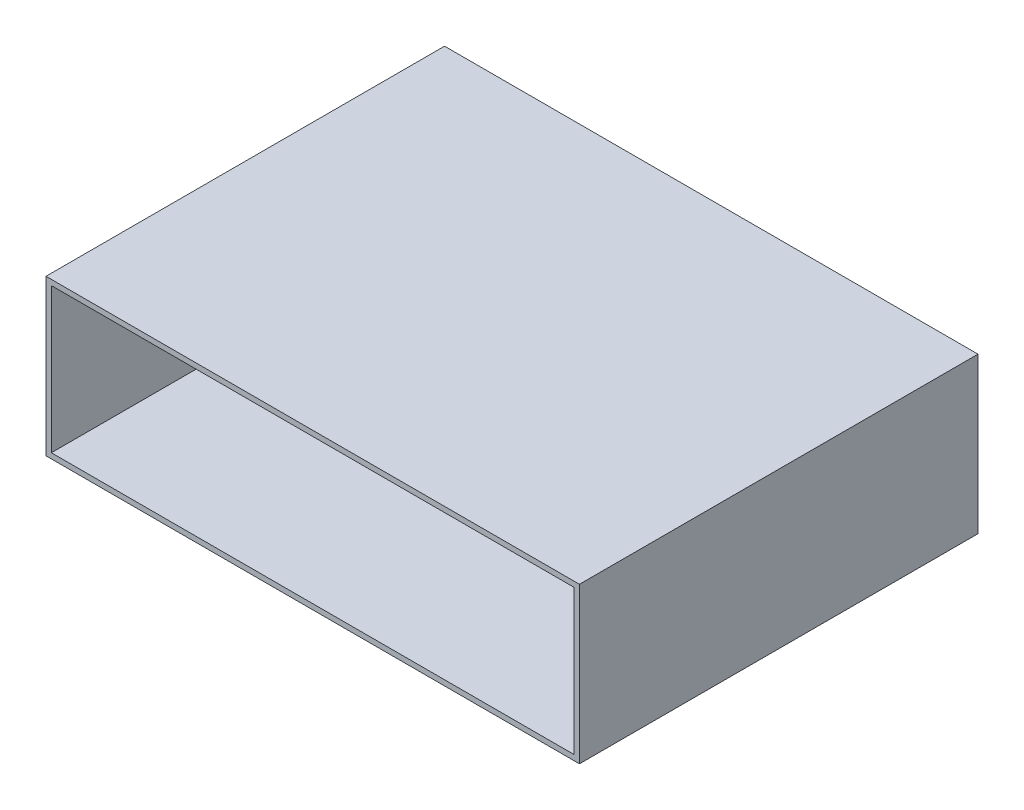
ISO-10303-21;
HEADER;
FILE_DESCRIPTION(('STEP AP214'),'2;1');
FILE_NAME('part.step','',(''),(''),'','','');
FILE_SCHEMA(('AUTOMOTIVE_DESIGN { 1 0 10303 214 1 1 1 1 }'));
ENDSEC;
DATA;
#1=APPLICATION_CONTEXT('core data for automotive mechanical design processes');
#2=APPLICATION_PROTOCOL_DEFINITION('international standard','automotive_design',2000,#1);
#3=PRODUCT_CONTEXT('',#1,'mechanical');
#4=PRODUCT('Part','Part','',(#3));
#5=PRODUCT_RELATED_PRODUCT_CATEGORY('part','',(#4));
#6=PRODUCT_DEFINITION_FORMATION('','',#4);
#7=PRODUCT_DEFINITION_CONTEXT('part definition',#1,'design');
#8=PRODUCT_DEFINITION('design','',#6,#7);
#9=PRODUCT_DEFINITION_SHAPE('','',#8);
#10=(LENGTH_UNIT() NAMED_UNIT(*) SI_UNIT(.MILLI.,.METRE.));
#11=(NAMED_UNIT(*) PLANE_ANGLE_UNIT() SI_UNIT($,.RADIAN.));
#12=(NAMED_UNIT(*) SI_UNIT($,.STERADIAN.) SOLID_ANGLE_UNIT());
#13=UNCERTAINTY_MEASURE_WITH_UNIT(LENGTH_MEASURE(1.E-05),#10,'distance_accuracy_value','');
#14=(GEOMETRIC_REPRESENTATION_CONTEXT(3) GLOBAL_UNCERTAINTY_ASSIGNED_CONTEXT((#13)) GLOBAL_UNIT_ASSIGNED_CONTEXT((#10,
#11,#12)) REPRESENTATION_CONTEXT('',''));
#15=CARTESIAN_POINT('',(0.,0.,0.));
#16=DIRECTION('',(0.,0.,1.));
#17=DIRECTION('',(1.,0.,0.));
#18=AXIS2_PLACEMENT_3D('',#15,#16,#17);
#19=CARTESIAN_POINT('',(0.,0.,235.775));
#20=DIRECTION('',(0.,0.,-1.));
#21=DIRECTION('',(-1.,0.,0.));
#22=AXIS2_PLACEMENT_3D('',#19,#20,#21);
#23=PLANE('',#22);
#24=DIRECTION('',(0.,1.,0.));
#25=VECTOR('',#24,1.);
#26=CARTESIAN_POINT('',(157.7875,-46.,235.775));
#27=LINE('',#26,#25);
#28=CARTESIAN_POINT('',(157.7875,-46.,235.775));
#29=VERTEX_POINT('',#28);
#30=CARTESIAN_POINT('',(157.7875,46.,235.775));
#31=VERTEX_POINT('',#30);
#32=EDGE_CURVE('E162',#29,#31,#27,.T.);
#33=ORIENTED_EDGE('',*,*,#32,.T.);
#34=DIRECTION('',(-1.,0.,0.));
#35=VECTOR('',#34,1.);
#36=CARTESIAN_POINT('',(-157.7875,46.,235.775));
#37=LINE('',#36,#35);
#38=CARTESIAN_POINT('',(-157.7875,46.,235.775));
#39=VERTEX_POINT('',#38);
#40=EDGE_CURVE('E166',#31,#39,#37,.T.);
#41=ORIENTED_EDGE('',*,*,#40,.T.);
#42=DIRECTION('',(0.,-1.,0.));
#43=VECTOR('',#42,1.);
#44=CARTESIAN_POINT('',(-157.7875,-46.,235.775));
#45=LINE('',#44,#43);
#46=CARTESIAN_POINT('',(-157.7875,-46.,235.775));
#47=VERTEX_POINT('',#46);
#48=EDGE_CURVE('E170',#39,#47,#45,.T.);
#49=ORIENTED_EDGE('',*,*,#48,.T.);
#50=DIRECTION('',(1.,0.,0.));
#51=VECTOR('',#50,1.);
#52=CARTESIAN_POINT('',(-157.7875,-46.,235.775));
#53=LINE('',#52,#51);
#54=EDGE_CURVE('E173',#47,#29,#53,.T.);
#55=ORIENTED_EDGE('',*,*,#54,.T.);
#56=EDGE_LOOP('',(#33,#41,#49,#55));
#57=FACE_BOUND('',#56,.T.);
#58=DIRECTION('',(0.,1.,0.));
#59=VECTOR('',#58,1.);
#60=CARTESIAN_POINT('',(154.6125,-42.825,235.775));
#61=LINE('',#60,#59);
#62=CARTESIAN_POINT('',(154.6125,-42.825,235.775));
#63=VERTEX_POINT('',#62);
#64=CARTESIAN_POINT('',(154.6125,42.825,235.775));
#65=VERTEX_POINT('',#64);
#66=EDGE_CURVE('E142',#63,#65,#61,.T.);
#67=ORIENTED_EDGE('',*,*,#66,.F.);
#68=DIRECTION('',(1.,0.,0.));
#69=VECTOR('',#68,1.);
#70=CARTESIAN_POINT('',(-154.6125,-42.825,235.775));
#71=LINE('',#70,#69);
#72=CARTESIAN_POINT('',(-154.6125,-42.825,235.775));
#73=VERTEX_POINT('',#72);
#74=EDGE_CURVE('E121',#73,#63,#71,.T.);
#75=ORIENTED_EDGE('',*,*,#74,.F.);
#76=DIRECTION('',(0.,-1.,0.));
#77=VECTOR('',#76,1.);
#78=CARTESIAN_POINT('',(-154.6125,-42.825,235.775));
#79=LINE('',#78,#77);
#80=CARTESIAN_POINT('',(-154.6125,42.825,235.775));
#81=VERTEX_POINT('',#80);
#82=EDGE_CURVE('E148',#81,#73,#79,.T.);
#83=ORIENTED_EDGE('',*,*,#82,.F.);
#84=DIRECTION('',(-1.,0.,0.));
#85=VECTOR('',#84,1.);
#86=CARTESIAN_POINT('',(-154.6125,42.825,235.775));
#87=LINE('',#86,#85);
#88=EDGE_CURVE('E145',#65,#81,#87,.T.);
#89=ORIENTED_EDGE('',*,*,#88,.F.);
#90=EDGE_LOOP('',(#67,#75,#83,#89));
#91=FACE_BOUND('',#90,.T.);
#92=ADVANCED_FACE('F47',(#57,#91),#23,.F.);
#93=CARTESIAN_POINT('',(0.,0.,0.));
#94=DIRECTION('',(0.,0.,-1.));
#95=DIRECTION('',(-1.,0.,0.));
#96=AXIS2_PLACEMENT_3D('',#93,#94,#95);
#97=PLANE('',#96);
#98=DIRECTION('',(0.,1.,0.));
#99=VECTOR('',#98,1.);
#100=CARTESIAN_POINT('',(157.7875,-46.,0.));
#101=LINE('',#100,#99);
#102=CARTESIAN_POINT('',(157.7875,-46.,0.));
#103=VERTEX_POINT('',#102);
#104=CARTESIAN_POINT('',(157.7875,46.,0.));
#105=VERTEX_POINT('',#104);
#106=EDGE_CURVE('E161',#103,#105,#101,.T.);
#107=ORIENTED_EDGE('',*,*,#106,.F.);
#108=DIRECTION('',(1.,0.,0.));
#109=VECTOR('',#108,1.);
#110=CARTESIAN_POINT('',(-157.7875,-46.,0.));
#111=LINE('',#110,#109);
#112=CARTESIAN_POINT('',(-157.7875,-46.,0.));
#113=VERTEX_POINT('',#112);
#114=EDGE_CURVE('E167',#113,#103,#111,.T.);
#115=ORIENTED_EDGE('',*,*,#114,.F.);
#116=DIRECTION('',(0.,-1.,0.));
#117=VECTOR('',#116,1.);
#118=CARTESIAN_POINT('',(-157.7875,-46.,0.));
#119=LINE('',#118,#117);
#120=CARTESIAN_POINT('',(-157.7875,46.,0.));
#121=VERTEX_POINT('',#120);
#122=EDGE_CURVE('E183',#121,#113,#119,.T.);
#123=ORIENTED_EDGE('',*,*,#122,.F.);
#124=DIRECTION('',(-1.,0.,0.));
#125=VECTOR('',#124,1.);
#126=CARTESIAN_POINT('',(-157.7875,46.,0.));
#127=LINE('',#126,#125);
#128=EDGE_CURVE('E180',#105,#121,#127,.T.);
#129=ORIENTED_EDGE('',*,*,#128,.F.);
#130=EDGE_LOOP('',(#107,#115,#123,#129));
#131=FACE_BOUND('',#130,.T.);
#132=ADVANCED_FACE('F206',(#131),#97,.T.);
#133=CARTESIAN_POINT('',(157.7875,-46.,235.775));
#134=DIRECTION('',(-1.,0.,0.));
#135=DIRECTION('',(0.,0.,1.));
#136=AXIS2_PLACEMENT_3D('',#133,#134,#135);
#137=PLANE('',#136);
#138=ORIENTED_EDGE('',*,*,#106,.T.);
#139=DIRECTION('',(0.,0.,-1.));
#140=VECTOR('',#139,1.);
#141=CARTESIAN_POINT('',(157.7875,46.,235.775));
#142=LINE('',#141,#140);
#143=EDGE_CURVE('E11',#31,#105,#142,.T.);
#144=ORIENTED_EDGE('',*,*,#143,.F.);
#145=ORIENTED_EDGE('',*,*,#32,.F.);
#146=DIRECTION('',(0.,0.,-1.));
#147=VECTOR('',#146,1.);
#148=CARTESIAN_POINT('',(157.7875,-46.,235.775));
#149=LINE('',#148,#147);
#150=EDGE_CURVE('E176',#29,#103,#149,.T.);
#151=ORIENTED_EDGE('',*,*,#150,.T.);
#152=EDGE_LOOP('',(#138,#144,#145,#151));
#153=FACE_BOUND('',#152,.T.);
#154=ADVANCED_FACE('F49',(#153),#137,.F.);
#155=CARTESIAN_POINT('',(-157.7875,46.,235.775));
#156=DIRECTION('',(0.,-1.,0.));
#157=DIRECTION('',(0.,0.,-1.));
#158=AXIS2_PLACEMENT_3D('',#155,#156,#157);
#159=PLANE('',#158);
#160=ORIENTED_EDGE('',*,*,#128,.T.);
#161=DIRECTION('',(0.,0.,-1.));
#162=VECTOR('',#161,1.);
#163=CARTESIAN_POINT('',(-157.7875,46.,235.775));
#164=LINE('',#163,#162);
#165=EDGE_CURVE('E56',#39,#121,#164,.T.);
#166=ORIENTED_EDGE('',*,*,#165,.F.);
#167=ORIENTED_EDGE('',*,*,#40,.F.);
#168=ORIENTED_EDGE('',*,*,#143,.T.);
#169=EDGE_LOOP('',(#160,#166,#167,#168));
#170=FACE_BOUND('',#169,.T.);
#171=ADVANCED_FACE('F216',(#170),#159,.F.);
#172=CARTESIAN_POINT('',(-157.7875,-46.,235.775));
#173=DIRECTION('',(1.,0.,0.));
#174=DIRECTION('',(0.,0.,-1.));
#175=AXIS2_PLACEMENT_3D('',#172,#173,#174);
#176=PLANE('',#175);
#177=ORIENTED_EDGE('',*,*,#122,.T.);
#178=DIRECTION('',(0.,0.,-1.));
#179=VECTOR('',#178,1.);
#180=CARTESIAN_POINT('',(-157.7875,-46.,235.775));
#181=LINE('',#180,#179);
#182=EDGE_CURVE('E191',#47,#113,#181,.T.);
#183=ORIENTED_EDGE('',*,*,#182,.F.);
#184=ORIENTED_EDGE('',*,*,#48,.F.);
#185=ORIENTED_EDGE('',*,*,#165,.T.);
#186=EDGE_LOOP('',(#177,#183,#184,#185));
#187=FACE_BOUND('',#186,.T.);
#188=ADVANCED_FACE('F200',(#187),#176,.F.);
#189=CARTESIAN_POINT('',(-157.7875,-46.,235.775));
#190=DIRECTION('',(0.,1.,0.));
#191=DIRECTION('',(0.,0.,1.));
#192=AXIS2_PLACEMENT_3D('',#189,#190,#191);
#193=PLANE('',#192);
#194=ORIENTED_EDGE('',*,*,#114,.T.);
#195=ORIENTED_EDGE('',*,*,#150,.F.);
#196=ORIENTED_EDGE('',*,*,#54,.F.);
#197=ORIENTED_EDGE('',*,*,#182,.T.);
#198=EDGE_LOOP('',(#194,#195,#196,#197));
#199=FACE_BOUND('',#198,.T.);
#200=ADVANCED_FACE('F209',(#199),#193,.F.);
#201=CARTESIAN_POINT('',(154.6125,-42.825,235.775));
#202=DIRECTION('',(-1.,0.,0.));
#203=DIRECTION('',(0.,-1.,0.));
#204=AXIS2_PLACEMENT_3D('',#201,#202,#203);
#205=PLANE('',#204);
#206=DIRECTION('',(0.,1.,0.));
#207=VECTOR('',#206,1.);
#208=CARTESIAN_POINT('',(154.6125,0.,3.175));
#209=LINE('',#208,#207);
#210=CARTESIAN_POINT('',(154.6125,-42.825,3.175));
#211=VERTEX_POINT('',#210);
#212=CARTESIAN_POINT('',(154.6125,42.825,3.17500000000001));
#213=VERTEX_POINT('',#212);
#214=EDGE_CURVE('E128',#211,#213,#209,.T.);
#215=ORIENTED_EDGE('',*,*,#214,.F.);
#216=DIRECTION('',(0.,0.,-1.));
#217=VECTOR('',#216,1.);
#218=CARTESIAN_POINT('',(154.6125,-42.825,235.775));
#219=LINE('',#218,#217);
#220=EDGE_CURVE('E115',#63,#211,#219,.T.);
#221=ORIENTED_EDGE('',*,*,#220,.F.);
#222=ORIENTED_EDGE('',*,*,#66,.T.);
#223=DIRECTION('',(0.,0.,-1.));
#224=VECTOR('',#223,1.);
#225=CARTESIAN_POINT('',(154.6125,42.825,235.775));
#226=LINE('',#225,#224);
#227=EDGE_CURVE('E130',#65,#213,#226,.T.);
#228=ORIENTED_EDGE('',*,*,#227,.T.);
#229=EDGE_LOOP('',(#215,#221,#222,#228));
#230=FACE_BOUND('',#229,.T.);
#231=ADVANCED_FACE('F129',(#230),#205,.T.);
#232=CARTESIAN_POINT('',(-154.6125,42.825,235.775));
#233=DIRECTION('',(0.,-1.,0.));
#234=DIRECTION('',(0.,0.,-1.));
#235=AXIS2_PLACEMENT_3D('',#232,#233,#234);
#236=PLANE('',#235);
#237=DIRECTION('',(1.,0.,0.));
#238=VECTOR('',#237,1.);
#239=CARTESIAN_POINT('',(0.,42.825,3.175));
#240=LINE('',#239,#238);
#241=CARTESIAN_POINT('',(-154.6125,42.825,3.17500000000001));
#242=VERTEX_POINT('',#241);
#243=EDGE_CURVE('E63',#242,#213,#240,.T.);
#244=ORIENTED_EDGE('',*,*,#243,.T.);
#245=ORIENTED_EDGE('',*,*,#227,.F.);
#246=ORIENTED_EDGE('',*,*,#88,.T.);
#247=DIRECTION('',(0.,0.,-1.));
#248=VECTOR('',#247,1.);
#249=CARTESIAN_POINT('',(-154.6125,42.825,235.775));
#250=LINE('',#249,#248);
#251=EDGE_CURVE('E156',#81,#242,#250,.T.);
#252=ORIENTED_EDGE('',*,*,#251,.T.);
#253=EDGE_LOOP('',(#244,#245,#246,#252));
#254=FACE_BOUND('',#253,.T.);
#255=ADVANCED_FACE('F236',(#254),#236,.T.);
#256=CARTESIAN_POINT('',(-154.6125,-42.825,235.775));
#257=DIRECTION('',(1.,0.,0.));
#258=DIRECTION('',(0.,0.,-1.));
#259=AXIS2_PLACEMENT_3D('',#256,#257,#258);
#260=PLANE('',#259);
#261=DIRECTION('',(0.,1.,0.));
#262=VECTOR('',#261,1.);
#263=CARTESIAN_POINT('',(-154.6125,0.,3.175));
#264=LINE('',#263,#262);
#265=CARTESIAN_POINT('',(-154.6125,-42.825,3.17500000000001));
#266=VERTEX_POINT('',#265);
#267=EDGE_CURVE('E71',#266,#242,#264,.T.);
#268=ORIENTED_EDGE('',*,*,#267,.T.);
#269=ORIENTED_EDGE('',*,*,#251,.F.);
#270=ORIENTED_EDGE('',*,*,#82,.T.);
#271=DIRECTION('',(0.,0.,-1.));
#272=VECTOR('',#271,1.);
#273=CARTESIAN_POINT('',(-154.6125,-42.825,235.775));
#274=LINE('',#273,#272);
#275=EDGE_CURVE('E125',#73,#266,#274,.T.);
#276=ORIENTED_EDGE('',*,*,#275,.T.);
#277=EDGE_LOOP('',(#268,#269,#270,#276));
#278=FACE_BOUND('',#277,.T.);
#279=ADVANCED_FACE('F240',(#278),#260,.T.);
#280=CARTESIAN_POINT('',(-154.6125,-42.825,235.775));
#281=DIRECTION('',(0.,1.,0.));
#282=DIRECTION('',(0.,0.,1.));
#283=AXIS2_PLACEMENT_3D('',#280,#281,#282);
#284=PLANE('',#283);
#285=DIRECTION('',(1.,0.,0.));
#286=VECTOR('',#285,1.);
#287=CARTESIAN_POINT('',(0.,-42.825,3.175));
#288=LINE('',#287,#286);
#289=EDGE_CURVE('E119',#266,#211,#288,.T.);
#290=ORIENTED_EDGE('',*,*,#289,.F.);
#291=ORIENTED_EDGE('',*,*,#275,.F.);
#292=ORIENTED_EDGE('',*,*,#74,.T.);
#293=ORIENTED_EDGE('',*,*,#220,.T.);
#294=EDGE_LOOP('',(#290,#291,#292,#293));
#295=FACE_BOUND('',#294,.T.);
#296=ADVANCED_FACE('F117',(#295),#284,.T.);
#297=CARTESIAN_POINT('',(0.,0.,3.175));
#298=DIRECTION('',(0.,0.,1.));
#299=DIRECTION('',(1.,0.,0.));
#300=AXIS2_PLACEMENT_3D('',#297,#298,#299);
#301=PLANE('',#300);
#302=ORIENTED_EDGE('',*,*,#289,.T.);
#303=ORIENTED_EDGE('',*,*,#214,.T.);
#304=ORIENTED_EDGE('',*,*,#243,.F.);
#305=ORIENTED_EDGE('',*,*,#267,.F.);
#306=EDGE_LOOP('',(#302,#303,#304,#305));
#307=FACE_BOUND('',#306,.T.);
#308=ADVANCED_FACE('F134',(#307),#301,.T.);
#309=CLOSED_SHELL('',(#92,#132,#154,#171,#188,#200,#231,#255,#279,#296,#308));
#310=MANIFOLD_SOLID_BREP('B2',#309);
#311=ADVANCED_BREP_SHAPE_REPRESENTATION('',(#18,#310),#14);
#312=SHAPE_DEFINITION_REPRESENTATION(#9,#311);
ENDSEC;
END-ISO-10303-21;
